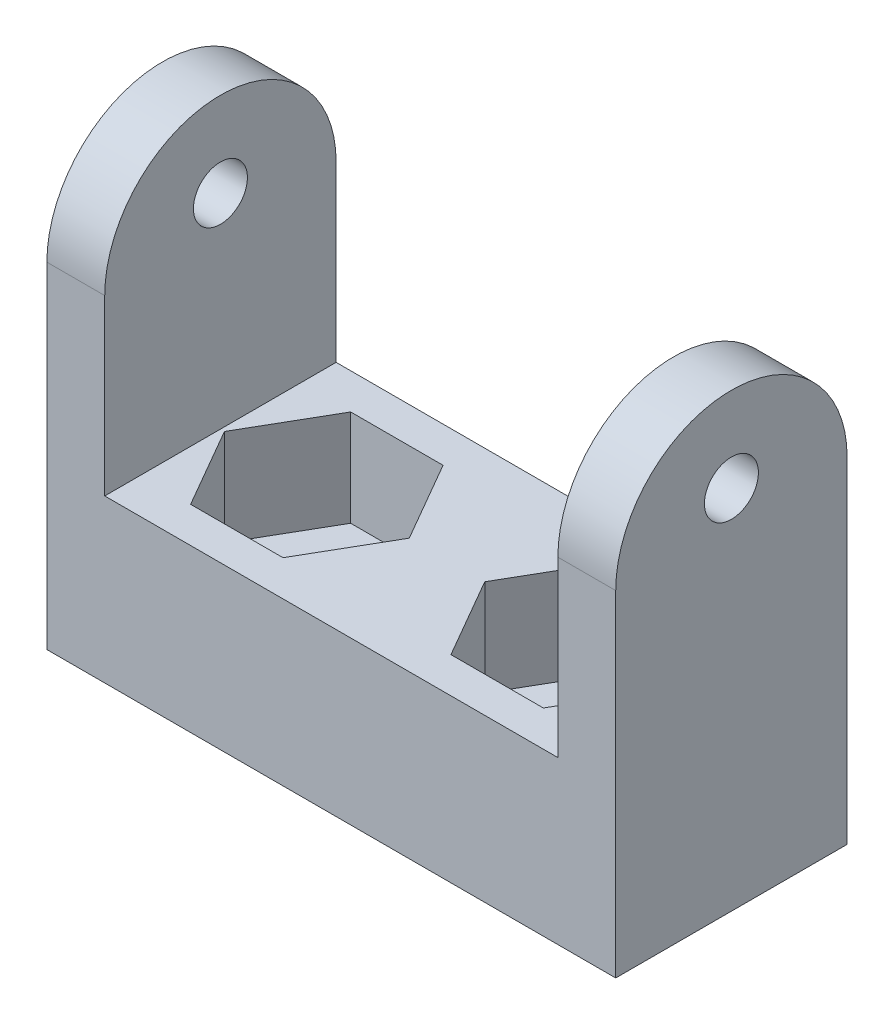
ISO-10303-21;
HEADER;
FILE_DESCRIPTION(('STEP AP214'),'2;1');
FILE_NAME('part.step','',(''),(''),'','','');
FILE_SCHEMA(('AUTOMOTIVE_DESIGN { 1 0 10303 214 1 1 1 1 }'));
ENDSEC;
DATA;
#1=APPLICATION_CONTEXT('core data for automotive mechanical design processes');
#2=APPLICATION_PROTOCOL_DEFINITION('international standard','automotive_design',2000,#1);
#3=PRODUCT_CONTEXT('',#1,'mechanical');
#4=PRODUCT('Part','Part','',(#3));
#5=PRODUCT_RELATED_PRODUCT_CATEGORY('part','',(#4));
#6=PRODUCT_DEFINITION_FORMATION('','',#4);
#7=PRODUCT_DEFINITION_CONTEXT('part definition',#1,'design');
#8=PRODUCT_DEFINITION('design','',#6,#7);
#9=PRODUCT_DEFINITION_SHAPE('','',#8);
#10=(LENGTH_UNIT() NAMED_UNIT(*) SI_UNIT(.MILLI.,.METRE.));
#11=(NAMED_UNIT(*) PLANE_ANGLE_UNIT() SI_UNIT($,.RADIAN.));
#12=(NAMED_UNIT(*) SI_UNIT($,.STERADIAN.) SOLID_ANGLE_UNIT());
#13=UNCERTAINTY_MEASURE_WITH_UNIT(LENGTH_MEASURE(1.E-05),#10,'distance_accuracy_value','');
#14=(GEOMETRIC_REPRESENTATION_CONTEXT(3) GLOBAL_UNCERTAINTY_ASSIGNED_CONTEXT((#13)) GLOBAL_UNIT_ASSIGNED_CONTEXT((#10,
#11,#12)) REPRESENTATION_CONTEXT('',''));
#15=CARTESIAN_POINT('',(0.,0.,0.));
#16=DIRECTION('',(0.,0.,1.));
#17=DIRECTION('',(1.,0.,0.));
#18=AXIS2_PLACEMENT_3D('',#15,#16,#17);
#19=CARTESIAN_POINT('',(0.,8.4,0.));
#20=DIRECTION('',(0.,1.,0.));
#21=DIRECTION('',(0.,0.,1.));
#22=AXIS2_PLACEMENT_3D('',#19,#20,#21);
#23=PLANE('',#22);
#24=DIRECTION('',(-1.,0.,0.));
#25=VECTOR('',#24,1.);
#26=CARTESIAN_POINT('',(-4.35399638286306,8.4,4.15));
#27=LINE('',#26,#25);
#28=CARTESIAN_POINT('',(-4.35399638286306,8.4,4.15));
#29=VERTEX_POINT('',#28);
#30=CARTESIAN_POINT('',(-9.14600361713695,8.4,4.15));
#31=VERTEX_POINT('',#30);
#32=EDGE_CURVE('E212',#29,#31,#27,.T.);
#33=ORIENTED_EDGE('',*,*,#32,.T.);
#34=DIRECTION('',(-0.5,0.,-0.866025403784439));
#35=VECTOR('',#34,1.);
#36=CARTESIAN_POINT('',(-9.14600361713695,8.4,4.15));
#37=LINE('',#36,#35);
#38=CARTESIAN_POINT('',(-11.5420072342739,8.4,0.));
#39=VERTEX_POINT('',#38);
#40=EDGE_CURVE('E63',#31,#39,#37,.T.);
#41=ORIENTED_EDGE('',*,*,#40,.T.);
#42=DIRECTION('',(0.5,0.,-0.866025403784439));
#43=VECTOR('',#42,1.);
#44=CARTESIAN_POINT('',(-11.5420072342739,8.4,0.));
#45=LINE('',#44,#43);
#46=CARTESIAN_POINT('',(-9.14600361713695,8.4,-4.15));
#47=VERTEX_POINT('',#46);
#48=EDGE_CURVE('E224',#39,#47,#45,.T.);
#49=ORIENTED_EDGE('',*,*,#48,.T.);
#50=DIRECTION('',(1.,0.,0.));
#51=VECTOR('',#50,1.);
#52=CARTESIAN_POINT('',(-9.14600361713695,8.4,-4.15));
#53=LINE('',#52,#51);
#54=CARTESIAN_POINT('',(-4.35399638286306,8.4,-4.15));
#55=VERTEX_POINT('',#54);
#56=EDGE_CURVE('E227',#47,#55,#53,.T.);
#57=ORIENTED_EDGE('',*,*,#56,.T.);
#58=DIRECTION('',(0.5,0.,0.866025403784439));
#59=VECTOR('',#58,1.);
#60=CARTESIAN_POINT('',(-4.35399638286306,8.4,-4.15));
#61=LINE('',#60,#59);
#62=CARTESIAN_POINT('',(-1.95799276572611,8.4,0.));
#63=VERTEX_POINT('',#62);
#64=EDGE_CURVE('E230',#55,#63,#61,.T.);
#65=ORIENTED_EDGE('',*,*,#64,.T.);
#66=DIRECTION('',(-0.5,0.,0.866025403784439));
#67=VECTOR('',#66,1.);
#68=CARTESIAN_POINT('',(-1.95799276572611,8.4,0.));
#69=LINE('',#68,#67);
#70=EDGE_CURVE('E233',#63,#29,#69,.T.);
#71=ORIENTED_EDGE('',*,*,#70,.T.);
#72=EDGE_LOOP('',(#33,#41,#49,#57,#65,#71));
#73=FACE_BOUND('',#72,.T.);
#74=DIRECTION('',(0.,0.,1.));
#75=VECTOR('',#74,1.);
#76=CARTESIAN_POINT('',(-11.75,8.4,6.));
#77=LINE('',#76,#75);
#78=CARTESIAN_POINT('',(-11.75,8.4,-6.));
#79=VERTEX_POINT('',#78);
#80=CARTESIAN_POINT('',(-11.75,8.4,6.));
#81=VERTEX_POINT('',#80);
#82=EDGE_CURVE('E265',#79,#81,#77,.T.);
#83=ORIENTED_EDGE('',*,*,#82,.T.);
#84=DIRECTION('',(1.,0.,0.));
#85=VECTOR('',#84,1.);
#86=CARTESIAN_POINT('',(11.75,8.4,6.));
#87=LINE('',#86,#85);
#88=CARTESIAN_POINT('',(11.75,8.4,6.));
#89=VERTEX_POINT('',#88);
#90=EDGE_CURVE('E268',#81,#89,#87,.T.);
#91=ORIENTED_EDGE('',*,*,#90,.T.);
#92=DIRECTION('',(0.,0.,-1.));
#93=VECTOR('',#92,1.);
#94=CARTESIAN_POINT('',(11.75,8.4,6.));
#95=LINE('',#94,#93);
#96=CARTESIAN_POINT('',(11.75,8.4,-6.));
#97=VERTEX_POINT('',#96);
#98=EDGE_CURVE('E271',#89,#97,#95,.T.);
#99=ORIENTED_EDGE('',*,*,#98,.T.);
#100=DIRECTION('',(-1.,0.,0.));
#101=VECTOR('',#100,1.);
#102=CARTESIAN_POINT('',(11.75,8.4,-6.));
#103=LINE('',#102,#101);
#104=EDGE_CURVE('E274',#97,#79,#103,.T.);
#105=ORIENTED_EDGE('',*,*,#104,.T.);
#106=EDGE_LOOP('',(#83,#91,#99,#105));
#107=FACE_BOUND('',#106,.T.);
#108=DIRECTION('',(-1.,0.,0.));
#109=VECTOR('',#108,1.);
#110=CARTESIAN_POINT('',(9.14600361713694,8.4,4.15));
#111=LINE('',#110,#109);
#112=CARTESIAN_POINT('',(9.14600361713694,8.4,4.15));
#113=VERTEX_POINT('',#112);
#114=CARTESIAN_POINT('',(4.35399638286305,8.4,4.15));
#115=VERTEX_POINT('',#114);
#116=EDGE_CURVE('E195',#113,#115,#111,.T.);
#117=ORIENTED_EDGE('',*,*,#116,.T.);
#118=DIRECTION('',(-0.5,0.,-0.866025403784439));
#119=VECTOR('',#118,1.);
#120=CARTESIAN_POINT('',(4.35399638286305,8.4,4.15));
#121=LINE('',#120,#119);
#122=CARTESIAN_POINT('',(1.9579927657261,8.4,0.));
#123=VERTEX_POINT('',#122);
#124=EDGE_CURVE('E55',#115,#123,#121,.T.);
#125=ORIENTED_EDGE('',*,*,#124,.T.);
#126=DIRECTION('',(0.5,0.,-0.866025403784439));
#127=VECTOR('',#126,1.);
#128=CARTESIAN_POINT('',(1.9579927657261,8.4,0.));
#129=LINE('',#128,#127);
#130=CARTESIAN_POINT('',(4.35399638286305,8.4,-4.15));
#131=VERTEX_POINT('',#130);
#132=EDGE_CURVE('E199',#123,#131,#129,.T.);
#133=ORIENTED_EDGE('',*,*,#132,.T.);
#134=DIRECTION('',(1.,0.,0.));
#135=VECTOR('',#134,1.);
#136=CARTESIAN_POINT('',(4.35399638286305,8.4,-4.15));
#137=LINE('',#136,#135);
#138=CARTESIAN_POINT('',(9.14600361713694,8.4,-4.15));
#139=VERTEX_POINT('',#138);
#140=EDGE_CURVE('E655',#131,#139,#137,.T.);
#141=ORIENTED_EDGE('',*,*,#140,.T.);
#142=DIRECTION('',(0.5,0.,0.866025403784439));
#143=VECTOR('',#142,1.);
#144=CARTESIAN_POINT('',(9.14600361713694,8.4,-4.15));
#145=LINE('',#144,#143);
#146=CARTESIAN_POINT('',(11.5420072342739,8.4,0.));
#147=VERTEX_POINT('',#146);
#148=EDGE_CURVE('E652',#139,#147,#145,.T.);
#149=ORIENTED_EDGE('',*,*,#148,.T.);
#150=DIRECTION('',(-0.5,0.,0.866025403784438));
#151=VECTOR('',#150,1.);
#152=CARTESIAN_POINT('',(11.5420072342739,8.4,0.));
#153=LINE('',#152,#151);
#154=EDGE_CURVE('E646',#147,#113,#153,.T.);
#155=ORIENTED_EDGE('',*,*,#154,.T.);
#156=EDGE_LOOP('',(#117,#125,#133,#141,#149,#155));
#157=FACE_BOUND('',#156,.T.);
#158=ADVANCED_FACE('F37',(#73,#107,#157),#23,.T.);
#159=CARTESIAN_POINT('',(0.,0.,0.));
#160=DIRECTION('',(0.,1.,0.));
#161=DIRECTION('',(0.,0.,1.));
#162=AXIS2_PLACEMENT_3D('',#159,#160,#161);
#163=PLANE('',#162);
#164=DIRECTION('',(0.,0.,-1.));
#165=VECTOR('',#164,1.);
#166=CARTESIAN_POINT('',(14.75,0.,-6.));
#167=LINE('',#166,#165);
#168=CARTESIAN_POINT('',(14.75,0.,6.));
#169=VERTEX_POINT('',#168);
#170=CARTESIAN_POINT('',(14.75,0.,-6.));
#171=VERTEX_POINT('',#170);
#172=EDGE_CURVE('E281',#169,#171,#167,.T.);
#173=ORIENTED_EDGE('',*,*,#172,.F.);
#174=DIRECTION('',(1.,0.,0.));
#175=VECTOR('',#174,1.);
#176=CARTESIAN_POINT('',(-14.75,0.,6.));
#177=LINE('',#176,#175);
#178=CARTESIAN_POINT('',(-14.75,0.,6.));
#179=VERTEX_POINT('',#178);
#180=EDGE_CURVE('E298',#179,#169,#177,.T.);
#181=ORIENTED_EDGE('',*,*,#180,.F.);
#182=DIRECTION('',(0.,0.,1.));
#183=VECTOR('',#182,1.);
#184=CARTESIAN_POINT('',(-14.75,0.,-6.));
#185=LINE('',#184,#183);
#186=CARTESIAN_POINT('',(-14.75,0.,-6.));
#187=VERTEX_POINT('',#186);
#188=EDGE_CURVE('E295',#187,#179,#185,.T.);
#189=ORIENTED_EDGE('',*,*,#188,.F.);
#190=DIRECTION('',(-1.,0.,0.));
#191=VECTOR('',#190,1.);
#192=CARTESIAN_POINT('',(-14.75,0.,-6.));
#193=LINE('',#192,#191);
#194=EDGE_CURVE('E292',#171,#187,#193,.T.);
#195=ORIENTED_EDGE('',*,*,#194,.F.);
#196=EDGE_LOOP('',(#173,#181,#189,#195));
#197=FACE_BOUND('',#196,.T.);
#198=CARTESIAN_POINT('',(-6.75,0.,0.));
#199=DIRECTION('',(0.,-1.,0.));
#200=DIRECTION('',(0.,0.,-1.));
#201=AXIS2_PLACEMENT_3D('',#198,#199,#200);
#202=CIRCLE('',#201,2.64999999999999);
#203=CARTESIAN_POINT('',(-6.75,0.,-2.64999999999999));
#204=VERTEX_POINT('',#203);
#205=EDGE_CURVE('E252',#204,#204,#202,.T.);
#206=ORIENTED_EDGE('',*,*,#205,.F.);
#207=EDGE_LOOP('',(#206));
#208=FACE_BOUND('',#207,.T.);
#209=CARTESIAN_POINT('',(6.75,0.,0.));
#210=DIRECTION('',(0.,-1.,0.));
#211=DIRECTION('',(0.,0.,-1.));
#212=AXIS2_PLACEMENT_3D('',#209,#210,#211);
#213=CIRCLE('',#212,2.64999999999999);
#214=CARTESIAN_POINT('',(6.75,0.,-2.64999999999999));
#215=VERTEX_POINT('',#214);
#216=EDGE_CURVE('E249',#215,#215,#213,.T.);
#217=ORIENTED_EDGE('',*,*,#216,.F.);
#218=EDGE_LOOP('',(#217));
#219=FACE_BOUND('',#218,.T.);
#220=ADVANCED_FACE('F352',(#197,#208,#219),#163,.F.);
#221=CARTESIAN_POINT('',(11.75,17.4,0.));
#222=DIRECTION('',(-1.,0.,0.));
#223=DIRECTION('',(0.,0.,1.));
#224=AXIS2_PLACEMENT_3D('',#221,#222,#223);
#225=CYLINDRICAL_SURFACE('',#224,6.);
#226=DIRECTION('',(1.,0.,0.));
#227=VECTOR('',#226,1.);
#228=CARTESIAN_POINT('',(11.75,17.4,-6.));
#229=LINE('',#228,#227);
#230=CARTESIAN_POINT('',(11.75,17.4,-6.));
#231=VERTEX_POINT('',#230);
#232=CARTESIAN_POINT('',(14.75,17.4,-6.));
#233=VERTEX_POINT('',#232);
#234=EDGE_CURVE('E321',#231,#233,#229,.T.);
#235=ORIENTED_EDGE('',*,*,#234,.F.);
#236=CARTESIAN_POINT('',(11.75,17.4,0.));
#237=DIRECTION('',(1.,0.,0.));
#238=DIRECTION('',(0.,0.,-1.));
#239=AXIS2_PLACEMENT_3D('',#236,#237,#238);
#240=CIRCLE('',#239,6.);
#241=CARTESIAN_POINT('',(11.75,17.4,6.));
#242=VERTEX_POINT('',#241);
#243=EDGE_CURVE('E47',#242,#231,#240,.F.);
#244=ORIENTED_EDGE('',*,*,#243,.F.);
#245=DIRECTION('',(1.,0.,0.));
#246=VECTOR('',#245,1.);
#247=CARTESIAN_POINT('',(11.75,17.4,6.));
#248=LINE('',#247,#246);
#249=CARTESIAN_POINT('',(14.75,17.4,6.));
#250=VERTEX_POINT('',#249);
#251=EDGE_CURVE('E324',#250,#242,#248,.F.);
#252=ORIENTED_EDGE('',*,*,#251,.F.);
#253=CARTESIAN_POINT('',(14.75,17.4,0.));
#254=DIRECTION('',(-1.,0.,0.));
#255=DIRECTION('',(0.,0.,1.));
#256=AXIS2_PLACEMENT_3D('',#253,#254,#255);
#257=CIRCLE('',#256,6.);
#258=EDGE_CURVE('E11',#233,#250,#257,.F.);
#259=ORIENTED_EDGE('',*,*,#258,.F.);
#260=EDGE_LOOP('',(#235,#244,#252,#259));
#261=FACE_BOUND('',#260,.T.);
#262=ADVANCED_FACE('F40',(#261),#225,.T.);
#263=CARTESIAN_POINT('',(-14.75,17.4,0.));
#264=DIRECTION('',(-1.,0.,0.));
#265=DIRECTION('',(0.,0.,1.));
#266=AXIS2_PLACEMENT_3D('',#263,#264,#265);
#267=CYLINDRICAL_SURFACE('',#266,6.);
#268=DIRECTION('',(1.,0.,0.));
#269=VECTOR('',#268,1.);
#270=CARTESIAN_POINT('',(-14.75,17.4,-6.));
#271=LINE('',#270,#269);
#272=CARTESIAN_POINT('',(-14.75,17.4,-6.));
#273=VERTEX_POINT('',#272);
#274=CARTESIAN_POINT('',(-11.75,17.4,-6.));
#275=VERTEX_POINT('',#274);
#276=EDGE_CURVE('E309',#273,#275,#271,.T.);
#277=ORIENTED_EDGE('',*,*,#276,.F.);
#278=CARTESIAN_POINT('',(-14.75,17.4,0.));
#279=DIRECTION('',(1.,0.,0.));
#280=DIRECTION('',(0.,0.,-1.));
#281=AXIS2_PLACEMENT_3D('',#278,#279,#280);
#282=CIRCLE('',#281,6.);
#283=CARTESIAN_POINT('',(-14.75,17.4,6.));
#284=VERTEX_POINT('',#283);
#285=EDGE_CURVE('E317',#284,#273,#282,.F.);
#286=ORIENTED_EDGE('',*,*,#285,.F.);
#287=DIRECTION('',(1.,0.,0.));
#288=VECTOR('',#287,1.);
#289=CARTESIAN_POINT('',(-14.75,17.4,6.));
#290=LINE('',#289,#288);
#291=CARTESIAN_POINT('',(-11.75,17.4,6.));
#292=VERTEX_POINT('',#291);
#293=EDGE_CURVE('E314',#292,#284,#290,.F.);
#294=ORIENTED_EDGE('',*,*,#293,.F.);
#295=CARTESIAN_POINT('',(-11.75,17.4,0.));
#296=DIRECTION('',(-1.,0.,0.));
#297=DIRECTION('',(0.,0.,1.));
#298=AXIS2_PLACEMENT_3D('',#295,#296,#297);
#299=CIRCLE('',#298,6.);
#300=EDGE_CURVE('E319',#275,#292,#299,.F.);
#301=ORIENTED_EDGE('',*,*,#300,.F.);
#302=EDGE_LOOP('',(#277,#286,#294,#301));
#303=FACE_BOUND('',#302,.T.);
#304=ADVANCED_FACE('F362',(#303),#267,.T.);
#305=CARTESIAN_POINT('',(14.75,23.4,-6.));
#306=DIRECTION('',(-1.,0.,0.));
#307=DIRECTION('',(0.,0.,1.));
#308=AXIS2_PLACEMENT_3D('',#305,#306,#307);
#309=PLANE('',#308);
#310=CARTESIAN_POINT('',(14.75,19.,0.));
#311=DIRECTION('',(-1.,0.,0.));
#312=DIRECTION('',(0.,0.,1.));
#313=AXIS2_PLACEMENT_3D('',#310,#311,#312);
#314=CIRCLE('',#313,1.4);
#315=CARTESIAN_POINT('',(14.75,19.,1.39999999999999));
#316=VERTEX_POINT('',#315);
#317=EDGE_CURVE('E256',#316,#316,#314,.T.);
#318=ORIENTED_EDGE('',*,*,#317,.T.);
#319=EDGE_LOOP('',(#318));
#320=FACE_BOUND('',#319,.T.);
#321=DIRECTION('',(0.,-1.,0.));
#322=VECTOR('',#321,1.);
#323=CARTESIAN_POINT('',(14.75,23.4,-6.));
#324=LINE('',#323,#322);
#325=EDGE_CURVE('E307',#233,#171,#324,.T.);
#326=ORIENTED_EDGE('',*,*,#325,.F.);
#327=ORIENTED_EDGE('',*,*,#258,.T.);
#328=DIRECTION('',(0.,-1.,0.));
#329=VECTOR('',#328,1.);
#330=CARTESIAN_POINT('',(14.75,23.4,6.));
#331=LINE('',#330,#329);
#332=EDGE_CURVE('E301',#250,#169,#331,.T.);
#333=ORIENTED_EDGE('',*,*,#332,.T.);
#334=ORIENTED_EDGE('',*,*,#172,.T.);
#335=EDGE_LOOP('',(#326,#327,#333,#334));
#336=FACE_BOUND('',#335,.T.);
#337=ADVANCED_FACE('F347',(#320,#336),#309,.F.);
#338=CARTESIAN_POINT('',(-14.75,23.4,-6.));
#339=DIRECTION('',(0.,0.,1.));
#340=DIRECTION('',(1.,0.,0.));
#341=AXIS2_PLACEMENT_3D('',#338,#339,#340);
#342=PLANE('',#341);
#343=DIRECTION('',(0.,1.,0.));
#344=VECTOR('',#343,1.);
#345=CARTESIAN_POINT('',(11.75,8.4,-6.));
#346=LINE('',#345,#344);
#347=EDGE_CURVE('E282',#97,#231,#346,.T.);
#348=ORIENTED_EDGE('',*,*,#347,.T.);
#349=ORIENTED_EDGE('',*,*,#234,.T.);
#350=ORIENTED_EDGE('',*,*,#325,.T.);
#351=ORIENTED_EDGE('',*,*,#194,.T.);
#352=DIRECTION('',(0.,-1.,0.));
#353=VECTOR('',#352,1.);
#354=CARTESIAN_POINT('',(-14.75,23.4,-6.));
#355=LINE('',#354,#353);
#356=EDGE_CURVE('E305',#273,#187,#355,.T.);
#357=ORIENTED_EDGE('',*,*,#356,.F.);
#358=ORIENTED_EDGE('',*,*,#276,.T.);
#359=DIRECTION('',(0.,1.,0.));
#360=VECTOR('',#359,1.);
#361=CARTESIAN_POINT('',(-11.75,8.4,-6.));
#362=LINE('',#361,#360);
#363=EDGE_CURVE('E278',#79,#275,#362,.T.);
#364=ORIENTED_EDGE('',*,*,#363,.F.);
#365=ORIENTED_EDGE('',*,*,#104,.F.);
#366=EDGE_LOOP('',(#348,#349,#350,#351,#357,#358,#364,#365));
#367=FACE_BOUND('',#366,.T.);
#368=ADVANCED_FACE('F336',(#367),#342,.F.);
#369=CARTESIAN_POINT('',(-14.75,23.4,-6.));
#370=DIRECTION('',(1.,0.,0.));
#371=DIRECTION('',(0.,0.,-1.));
#372=AXIS2_PLACEMENT_3D('',#369,#370,#371);
#373=PLANE('',#372);
#374=CARTESIAN_POINT('',(-14.75,19.,0.));
#375=DIRECTION('',(-1.,0.,0.));
#376=DIRECTION('',(0.,0.,1.));
#377=AXIS2_PLACEMENT_3D('',#374,#375,#376);
#378=CIRCLE('',#377,1.4);
#379=CARTESIAN_POINT('',(-14.75,19.,1.4));
#380=VERTEX_POINT('',#379);
#381=EDGE_CURVE('E255',#380,#380,#378,.T.);
#382=ORIENTED_EDGE('',*,*,#381,.F.);
#383=EDGE_LOOP('',(#382));
#384=FACE_BOUND('',#383,.T.);
#385=DIRECTION('',(0.,-1.,0.));
#386=VECTOR('',#385,1.);
#387=CARTESIAN_POINT('',(-14.75,23.4,6.));
#388=LINE('',#387,#386);
#389=EDGE_CURVE('E303',#284,#179,#388,.T.);
#390=ORIENTED_EDGE('',*,*,#389,.F.);
#391=ORIENTED_EDGE('',*,*,#285,.T.);
#392=ORIENTED_EDGE('',*,*,#356,.T.);
#393=ORIENTED_EDGE('',*,*,#188,.T.);
#394=EDGE_LOOP('',(#390,#391,#392,#393));
#395=FACE_BOUND('',#394,.T.);
#396=ADVANCED_FACE('F356',(#384,#395),#373,.F.);
#397=CARTESIAN_POINT('',(-14.75,23.4,6.));
#398=DIRECTION('',(0.,0.,-1.));
#399=DIRECTION('',(-1.,0.,0.));
#400=AXIS2_PLACEMENT_3D('',#397,#398,#399);
#401=PLANE('',#400);
#402=ORIENTED_EDGE('',*,*,#332,.F.);
#403=ORIENTED_EDGE('',*,*,#251,.T.);
#404=DIRECTION('',(0.,1.,0.));
#405=VECTOR('',#404,1.);
#406=CARTESIAN_POINT('',(11.75,8.4,6.));
#407=LINE('',#406,#405);
#408=EDGE_CURVE('E285',#89,#242,#407,.T.);
#409=ORIENTED_EDGE('',*,*,#408,.F.);
#410=ORIENTED_EDGE('',*,*,#90,.F.);
#411=DIRECTION('',(0.,1.,0.));
#412=VECTOR('',#411,1.);
#413=CARTESIAN_POINT('',(-11.75,8.4,6.));
#414=LINE('',#413,#412);
#415=EDGE_CURVE('E277',#81,#292,#414,.T.);
#416=ORIENTED_EDGE('',*,*,#415,.T.);
#417=ORIENTED_EDGE('',*,*,#293,.T.);
#418=ORIENTED_EDGE('',*,*,#389,.T.);
#419=ORIENTED_EDGE('',*,*,#180,.T.);
#420=EDGE_LOOP('',(#402,#403,#409,#410,#416,#417,#418,#419));
#421=FACE_BOUND('',#420,.T.);
#422=ADVANCED_FACE('F343',(#421),#401,.F.);
#423=CARTESIAN_POINT('',(-11.75,8.4,6.));
#424=DIRECTION('',(-1.,0.,0.));
#425=DIRECTION('',(0.,0.,1.));
#426=AXIS2_PLACEMENT_3D('',#423,#424,#425);
#427=PLANE('',#426);
#428=CARTESIAN_POINT('',(-11.75,19.,0.));
#429=DIRECTION('',(-1.,0.,0.));
#430=DIRECTION('',(0.,0.,1.));
#431=AXIS2_PLACEMENT_3D('',#428,#429,#430);
#432=CIRCLE('',#431,1.4);
#433=CARTESIAN_POINT('',(-11.75,19.,1.4));
#434=VERTEX_POINT('',#433);
#435=EDGE_CURVE('E262',#434,#434,#432,.T.);
#436=ORIENTED_EDGE('',*,*,#435,.T.);
#437=EDGE_LOOP('',(#436));
#438=FACE_BOUND('',#437,.T.);
#439=ORIENTED_EDGE('',*,*,#363,.T.);
#440=ORIENTED_EDGE('',*,*,#300,.T.);
#441=ORIENTED_EDGE('',*,*,#415,.F.);
#442=ORIENTED_EDGE('',*,*,#82,.F.);
#443=EDGE_LOOP('',(#439,#440,#441,#442));
#444=FACE_BOUND('',#443,.T.);
#445=ADVANCED_FACE('F360',(#438,#444),#427,.F.);
#446=CARTESIAN_POINT('',(11.75,8.4,6.));
#447=DIRECTION('',(1.,0.,0.));
#448=DIRECTION('',(0.,0.,-1.));
#449=AXIS2_PLACEMENT_3D('',#446,#447,#448);
#450=PLANE('',#449);
#451=CARTESIAN_POINT('',(11.75,19.,0.));
#452=DIRECTION('',(1.,0.,0.));
#453=DIRECTION('',(0.,0.,-1.));
#454=AXIS2_PLACEMENT_3D('',#451,#452,#453);
#455=CIRCLE('',#454,1.4);
#456=CARTESIAN_POINT('',(11.75,19.,1.39999999999999));
#457=VERTEX_POINT('',#456);
#458=EDGE_CURVE('E259',#457,#457,#455,.T.);
#459=ORIENTED_EDGE('',*,*,#458,.T.);
#460=EDGE_LOOP('',(#459));
#461=FACE_BOUND('',#460,.T.);
#462=ORIENTED_EDGE('',*,*,#408,.T.);
#463=ORIENTED_EDGE('',*,*,#243,.T.);
#464=ORIENTED_EDGE('',*,*,#347,.F.);
#465=ORIENTED_EDGE('',*,*,#98,.F.);
#466=EDGE_LOOP('',(#462,#463,#464,#465));
#467=FACE_BOUND('',#466,.T.);
#468=ADVANCED_FACE('F329',(#461,#467),#450,.F.);
#469=CARTESIAN_POINT('',(14.75,19.,0.));
#470=DIRECTION('',(-1.,0.,0.));
#471=DIRECTION('',(0.,0.,1.));
#472=AXIS2_PLACEMENT_3D('',#469,#470,#471);
#473=CYLINDRICAL_SURFACE('',#472,1.4);
#474=CARTESIAN_POINT('',(14.75,19.,1.39999999999999));
#475=CARTESIAN_POINT('',(14.71875,19.,1.39999999999999));
#476=CARTESIAN_POINT('',(14.6875,19.,1.39999999999999));
#477=CARTESIAN_POINT('',(14.625,19.,1.39999999999999));
#478=CARTESIAN_POINT('',(14.59375,19.,1.39999999999999));
#479=CARTESIAN_POINT('',(14.53125,19.,1.39999999999999));
#480=CARTESIAN_POINT('',(14.5,19.,1.39999999999999));
#481=CARTESIAN_POINT('',(14.4375,19.,1.39999999999999));
#482=CARTESIAN_POINT('',(14.40625,19.,1.39999999999999));
#483=CARTESIAN_POINT('',(14.34375,19.,1.39999999999999));
#484=CARTESIAN_POINT('',(14.3125,19.,1.39999999999999));
#485=CARTESIAN_POINT('',(14.25,19.,1.39999999999999));
#486=CARTESIAN_POINT('',(14.21875,19.,1.39999999999999));
#487=CARTESIAN_POINT('',(14.15625,19.,1.39999999999999));
#488=CARTESIAN_POINT('',(14.125,19.,1.39999999999999));
#489=CARTESIAN_POINT('',(14.0625,19.,1.39999999999999));
#490=CARTESIAN_POINT('',(14.03125,19.,1.39999999999999));
#491=CARTESIAN_POINT('',(13.96875,19.,1.39999999999999));
#492=CARTESIAN_POINT('',(13.9375,19.,1.39999999999999));
#493=CARTESIAN_POINT('',(13.875,19.,1.39999999999999));
#494=CARTESIAN_POINT('',(13.84375,19.,1.39999999999999));
#495=CARTESIAN_POINT('',(13.78125,19.,1.39999999999999));
#496=CARTESIAN_POINT('',(13.75,19.,1.39999999999999));
#497=CARTESIAN_POINT('',(13.6875,19.,1.39999999999999));
#498=CARTESIAN_POINT('',(13.65625,19.,1.39999999999999));
#499=CARTESIAN_POINT('',(13.59375,19.,1.39999999999999));
#500=CARTESIAN_POINT('',(13.5625,19.,1.39999999999999));
#501=CARTESIAN_POINT('',(13.5,19.,1.39999999999999));
#502=CARTESIAN_POINT('',(13.46875,19.,1.39999999999999));
#503=CARTESIAN_POINT('',(13.40625,19.,1.39999999999999));
#504=CARTESIAN_POINT('',(13.375,19.,1.39999999999999));
#505=CARTESIAN_POINT('',(13.3125,19.,1.39999999999999));
#506=CARTESIAN_POINT('',(13.28125,19.,1.39999999999999));
#507=CARTESIAN_POINT('',(13.21875,19.,1.39999999999999));
#508=CARTESIAN_POINT('',(13.1875,19.,1.39999999999999));
#509=CARTESIAN_POINT('',(13.125,19.,1.39999999999999));
#510=CARTESIAN_POINT('',(13.09375,19.,1.39999999999999));
#511=CARTESIAN_POINT('',(13.03125,19.,1.39999999999999));
#512=CARTESIAN_POINT('',(13.,19.,1.39999999999999));
#513=CARTESIAN_POINT('',(12.9375,19.,1.39999999999999));
#514=CARTESIAN_POINT('',(12.90625,19.,1.39999999999999));
#515=CARTESIAN_POINT('',(12.84375,19.,1.39999999999999));
#516=CARTESIAN_POINT('',(12.8125,19.,1.39999999999999));
#517=CARTESIAN_POINT('',(12.75,19.,1.39999999999999));
#518=CARTESIAN_POINT('',(12.71875,19.,1.39999999999999));
#519=CARTESIAN_POINT('',(12.65625,19.,1.39999999999999));
#520=CARTESIAN_POINT('',(12.625,19.,1.39999999999999));
#521=CARTESIAN_POINT('',(12.5625,19.,1.39999999999999));
#522=CARTESIAN_POINT('',(12.53125,19.,1.39999999999999));
#523=CARTESIAN_POINT('',(12.46875,19.,1.39999999999999));
#524=CARTESIAN_POINT('',(12.4375,19.,1.39999999999999));
#525=CARTESIAN_POINT('',(12.375,19.,1.39999999999999));
#526=CARTESIAN_POINT('',(12.34375,19.,1.39999999999999));
#527=CARTESIAN_POINT('',(12.28125,19.,1.39999999999999));
#528=CARTESIAN_POINT('',(12.25,19.,1.39999999999999));
#529=CARTESIAN_POINT('',(12.1875,19.,1.39999999999999));
#530=CARTESIAN_POINT('',(12.15625,19.,1.39999999999999));
#531=CARTESIAN_POINT('',(12.09375,19.,1.39999999999999));
#532=CARTESIAN_POINT('',(12.0625,19.,1.39999999999999));
#533=CARTESIAN_POINT('',(12.,19.,1.39999999999999));
#534=CARTESIAN_POINT('',(11.96875,19.,1.39999999999999));
#535=CARTESIAN_POINT('',(11.90625,19.,1.39999999999999));
#536=CARTESIAN_POINT('',(11.875,19.,1.39999999999999));
#537=CARTESIAN_POINT('',(11.8125,19.,1.39999999999999));
#538=CARTESIAN_POINT('',(11.78125,19.,1.39999999999999));
#539=CARTESIAN_POINT('',(11.75,19.,1.39999999999999));
#540=B_SPLINE_CURVE_WITH_KNOTS('',3,(#474,#475,#476,#477,#478,#479,#480,#481,#482,#483,#484,
#485,#486,#487,#488,#489,#490,#491,#492,#493,#494,#495,#496,#497,#498,#499,#500,#501,#502,#503,
#504,#505,#506,#507,#508,#509,#510,#511,#512,#513,#514,#515,#516,#517,#518,#519,#520,#521,#522,
#523,#524,#525,#526,#527,#528,#529,#530,#531,#532,#533,#534,#535,#536,#537,#538,#539),
.UNSPECIFIED.,.F.,.F.,(4,2,2,2,2,2,2,2,2,2,2,2,2,2,2,2,2,2,2,2,2,2,2,2,2,2,2,2,2,2,2,2,4),(0.,
0.0937500000000001,0.1875,0.28125,0.375,0.46875,0.5625,0.656250000000001,0.750000000000001,
0.843750000000001,0.937500000000001,1.03125,1.125,1.21875,1.3125,1.40625,1.5,1.59375,1.6875,
1.78125,1.875,1.96875,2.0625,2.15625,2.25,2.34375,2.4375,2.53125,2.625,2.71875,2.8125,2.90625,
3.),.UNSPECIFIED.);
#541=EDGE_CURVE('BSEAM384',#316,#457,#540,.T.);
#542=ORIENTED_EDGE('',*,*,#317,.F.);
#543=ORIENTED_EDGE('',*,*,#458,.F.);
#544=ORIENTED_EDGE('',*,*,#541,.T.);
#545=ORIENTED_EDGE('',*,*,#541,.F.);
#546=EDGE_LOOP('',(#542,#544,#543,#545));
#547=FACE_BOUND('',#546,.T.);
#548=ADVANCED_FACE('F384',(#547),#473,.F.);
#549=CARTESIAN_POINT('',(-14.75,19.,1.4));
#550=CARTESIAN_POINT('',(-14.71875,19.,1.4));
#551=CARTESIAN_POINT('',(-14.6875,19.,1.4));
#552=CARTESIAN_POINT('',(-14.625,19.,1.4));
#553=CARTESIAN_POINT('',(-14.59375,19.,1.4));
#554=CARTESIAN_POINT('',(-14.53125,19.,1.4));
#555=CARTESIAN_POINT('',(-14.5,19.,1.4));
#556=CARTESIAN_POINT('',(-14.4375,19.,1.4));
#557=CARTESIAN_POINT('',(-14.40625,19.,1.4));
#558=CARTESIAN_POINT('',(-14.34375,19.,1.4));
#559=CARTESIAN_POINT('',(-14.3125,19.,1.4));
#560=CARTESIAN_POINT('',(-14.25,19.,1.4));
#561=CARTESIAN_POINT('',(-14.21875,19.,1.4));
#562=CARTESIAN_POINT('',(-14.15625,19.,1.4));
#563=CARTESIAN_POINT('',(-14.125,19.,1.4));
#564=CARTESIAN_POINT('',(-14.0625,19.,1.4));
#565=CARTESIAN_POINT('',(-14.03125,19.,1.4));
#566=CARTESIAN_POINT('',(-13.96875,19.,1.4));
#567=CARTESIAN_POINT('',(-13.9375,19.,1.4));
#568=CARTESIAN_POINT('',(-13.875,19.,1.4));
#569=CARTESIAN_POINT('',(-13.84375,19.,1.4));
#570=CARTESIAN_POINT('',(-13.78125,19.,1.4));
#571=CARTESIAN_POINT('',(-13.75,19.,1.4));
#572=CARTESIAN_POINT('',(-13.6875,19.,1.4));
#573=CARTESIAN_POINT('',(-13.65625,19.,1.4));
#574=CARTESIAN_POINT('',(-13.59375,19.,1.4));
#575=CARTESIAN_POINT('',(-13.5625,19.,1.4));
#576=CARTESIAN_POINT('',(-13.5,19.,1.4));
#577=CARTESIAN_POINT('',(-13.46875,19.,1.4));
#578=CARTESIAN_POINT('',(-13.40625,19.,1.4));
#579=CARTESIAN_POINT('',(-13.375,19.,1.4));
#580=CARTESIAN_POINT('',(-13.3125,19.,1.4));
#581=CARTESIAN_POINT('',(-13.28125,19.,1.4));
#582=CARTESIAN_POINT('',(-13.21875,19.,1.4));
#583=CARTESIAN_POINT('',(-13.1875,19.,1.4));
#584=CARTESIAN_POINT('',(-13.125,19.,1.4));
#585=CARTESIAN_POINT('',(-13.09375,19.,1.4));
#586=CARTESIAN_POINT('',(-13.03125,19.,1.4));
#587=CARTESIAN_POINT('',(-13.,19.,1.4));
#588=CARTESIAN_POINT('',(-12.9375,19.,1.4));
#589=CARTESIAN_POINT('',(-12.90625,19.,1.4));
#590=CARTESIAN_POINT('',(-12.84375,19.,1.4));
#591=CARTESIAN_POINT('',(-12.8125,19.,1.4));
#592=CARTESIAN_POINT('',(-12.75,19.,1.4));
#593=CARTESIAN_POINT('',(-12.71875,19.,1.4));
#594=CARTESIAN_POINT('',(-12.65625,19.,1.4));
#595=CARTESIAN_POINT('',(-12.625,19.,1.4));
#596=CARTESIAN_POINT('',(-12.5625,19.,1.4));
#597=CARTESIAN_POINT('',(-12.53125,19.,1.4));
#598=CARTESIAN_POINT('',(-12.46875,19.,1.4));
#599=CARTESIAN_POINT('',(-12.4375,19.,1.4));
#600=CARTESIAN_POINT('',(-12.375,19.,1.4));
#601=CARTESIAN_POINT('',(-12.34375,19.,1.4));
#602=CARTESIAN_POINT('',(-12.28125,19.,1.4));
#603=CARTESIAN_POINT('',(-12.25,19.,1.4));
#604=CARTESIAN_POINT('',(-12.1875,19.,1.4));
#605=CARTESIAN_POINT('',(-12.15625,19.,1.4));
#606=CARTESIAN_POINT('',(-12.09375,19.,1.4));
#607=CARTESIAN_POINT('',(-12.0625,19.,1.4));
#608=CARTESIAN_POINT('',(-12.,19.,1.4));
#609=CARTESIAN_POINT('',(-11.96875,19.,1.4));
#610=CARTESIAN_POINT('',(-11.90625,19.,1.4));
#611=CARTESIAN_POINT('',(-11.875,19.,1.4));
#612=CARTESIAN_POINT('',(-11.8125,19.,1.4));
#613=CARTESIAN_POINT('',(-11.78125,19.,1.4));
#614=CARTESIAN_POINT('',(-11.75,19.,1.4));
#615=B_SPLINE_CURVE_WITH_KNOTS('',3,(#549,#550,#551,#552,#553,#554,#555,#556,#557,#558,#559,
#560,#561,#562,#563,#564,#565,#566,#567,#568,#569,#570,#571,#572,#573,#574,#575,#576,#577,#578,
#579,#580,#581,#582,#583,#584,#585,#586,#587,#588,#589,#590,#591,#592,#593,#594,#595,#596,#597,
#598,#599,#600,#601,#602,#603,#604,#605,#606,#607,#608,#609,#610,#611,#612,#613,#614),
.UNSPECIFIED.,.F.,.F.,(4,2,2,2,2,2,2,2,2,2,2,2,2,2,2,2,2,2,2,2,2,2,2,2,2,2,2,2,2,2,2,2,4),(0.,
0.0937500000000001,0.1875,0.28125,0.375,0.46875,0.5625,0.656250000000001,0.750000000000001,
0.843750000000001,0.937500000000001,1.03125,1.125,1.21875,1.3125,1.40625,1.5,1.59375,1.6875,
1.78125,1.875,1.96875,2.0625,2.15625,2.25,2.34375,2.4375,2.53125,2.625,2.71875,2.8125,2.90625,
3.),.UNSPECIFIED.);
#616=EDGE_CURVE('BSEAM380',#380,#434,#615,.T.);
#617=ORIENTED_EDGE('',*,*,#381,.T.);
#618=ORIENTED_EDGE('',*,*,#435,.F.);
#619=ORIENTED_EDGE('',*,*,#616,.T.);
#620=ORIENTED_EDGE('',*,*,#616,.F.);
#621=EDGE_LOOP('',(#617,#619,#618,#620));
#622=FACE_BOUND('',#621,.T.);
#623=ADVANCED_FACE('F380',(#622),#473,.F.);
#624=CARTESIAN_POINT('',(-6.75,0.,0.));
#625=DIRECTION('',(0.,-1.,0.));
#626=DIRECTION('',(0.,0.,-1.));
#627=AXIS2_PLACEMENT_3D('',#624,#625,#626);
#628=CYLINDRICAL_SURFACE('',#627,2.64999999999999);
#629=CARTESIAN_POINT('',(-6.75,3.4,0.));
#630=DIRECTION('',(0.,-1.,0.));
#631=DIRECTION('',(0.,0.,-1.));
#632=AXIS2_PLACEMENT_3D('',#629,#630,#631);
#633=CIRCLE('',#632,2.64999999999999);
#634=CARTESIAN_POINT('',(-6.75,3.4,-2.64999999999999));
#635=VERTEX_POINT('',#634);
#636=EDGE_CURVE('E42',#635,#635,#633,.F.);
#637=ORIENTED_EDGE('',*,*,#636,.T.);
#638=EDGE_LOOP('',(#637));
#639=FACE_BOUND('',#638,.T.);
#640=ORIENTED_EDGE('',*,*,#205,.T.);
#641=EDGE_LOOP('',(#640));
#642=FACE_BOUND('',#641,.T.);
#643=ADVANCED_FACE('F429',(#639,#642),#628,.F.);
#644=CARTESIAN_POINT('',(6.75,0.,0.));
#645=DIRECTION('',(0.,-1.,0.));
#646=DIRECTION('',(0.,0.,-1.));
#647=AXIS2_PLACEMENT_3D('',#644,#645,#646);
#648=CYLINDRICAL_SURFACE('',#647,2.64999999999999);
#649=CARTESIAN_POINT('',(6.75,3.4,0.));
#650=DIRECTION('',(0.,-1.,0.));
#651=DIRECTION('',(0.,0.,-1.));
#652=AXIS2_PLACEMENT_3D('',#649,#650,#651);
#653=CIRCLE('',#652,2.64999999999999);
#654=CARTESIAN_POINT('',(6.75,3.4,-2.64999999999999));
#655=VERTEX_POINT('',#654);
#656=EDGE_CURVE('E200',#655,#655,#653,.F.);
#657=ORIENTED_EDGE('',*,*,#656,.T.);
#658=EDGE_LOOP('',(#657));
#659=FACE_BOUND('',#658,.T.);
#660=ORIENTED_EDGE('',*,*,#216,.T.);
#661=EDGE_LOOP('',(#660));
#662=FACE_BOUND('',#661,.T.);
#663=ADVANCED_FACE('F436',(#659,#662),#648,.F.);
#664=CARTESIAN_POINT('',(0.,3.4,0.));
#665=DIRECTION('',(0.,-1.,0.));
#666=DIRECTION('',(0.,0.,-1.));
#667=AXIS2_PLACEMENT_3D('',#664,#665,#666);
#668=PLANE('',#667);
#669=DIRECTION('',(-0.5,0.,-0.866025403784439));
#670=VECTOR('',#669,1.);
#671=CARTESIAN_POINT('',(4.35399638286305,3.4,4.15));
#672=LINE('',#671,#670);
#673=CARTESIAN_POINT('',(4.35399638286305,3.4,4.15));
#674=VERTEX_POINT('',#673);
#675=CARTESIAN_POINT('',(1.9579927657261,3.4,0.));
#676=VERTEX_POINT('',#675);
#677=EDGE_CURVE('E185',#674,#676,#672,.T.);
#678=ORIENTED_EDGE('',*,*,#677,.F.);
#679=DIRECTION('',(-1.,0.,0.));
#680=VECTOR('',#679,1.);
#681=CARTESIAN_POINT('',(9.14600361713694,3.4,4.15));
#682=LINE('',#681,#680);
#683=CARTESIAN_POINT('',(9.14600361713694,3.4,4.15));
#684=VERTEX_POINT('',#683);
#685=EDGE_CURVE('E660',#684,#674,#682,.T.);
#686=ORIENTED_EDGE('',*,*,#685,.F.);
#687=DIRECTION('',(-0.5,0.,0.866025403784438));
#688=VECTOR('',#687,1.);
#689=CARTESIAN_POINT('',(11.5420072342739,3.4,0.));
#690=LINE('',#689,#688);
#691=CARTESIAN_POINT('',(11.5420072342739,3.4,0.));
#692=VERTEX_POINT('',#691);
#693=EDGE_CURVE('E669',#692,#684,#690,.T.);
#694=ORIENTED_EDGE('',*,*,#693,.F.);
#695=DIRECTION('',(0.5,0.,0.866025403784439));
#696=VECTOR('',#695,1.);
#697=CARTESIAN_POINT('',(9.14600361713694,3.4,-4.15));
#698=LINE('',#697,#696);
#699=CARTESIAN_POINT('',(9.14600361713694,3.4,-4.15));
#700=VERTEX_POINT('',#699);
#701=EDGE_CURVE('E671',#700,#692,#698,.T.);
#702=ORIENTED_EDGE('',*,*,#701,.F.);
#703=DIRECTION('',(1.,0.,0.));
#704=VECTOR('',#703,1.);
#705=CARTESIAN_POINT('',(4.35399638286305,3.4,-4.15));
#706=LINE('',#705,#704);
#707=CARTESIAN_POINT('',(4.35399638286305,3.4,-4.15));
#708=VERTEX_POINT('',#707);
#709=EDGE_CURVE('E187',#708,#700,#706,.T.);
#710=ORIENTED_EDGE('',*,*,#709,.F.);
#711=DIRECTION('',(0.5,0.,-0.866025403784439));
#712=VECTOR('',#711,1.);
#713=CARTESIAN_POINT('',(1.9579927657261,3.4,0.));
#714=LINE('',#713,#712);
#715=EDGE_CURVE('E180',#676,#708,#714,.T.);
#716=ORIENTED_EDGE('',*,*,#715,.F.);
#717=EDGE_LOOP('',(#678,#686,#694,#702,#710,#716));
#718=FACE_BOUND('',#717,.T.);
#719=ORIENTED_EDGE('',*,*,#656,.F.);
#720=EDGE_LOOP('',(#719));
#721=FACE_BOUND('',#720,.T.);
#722=ADVANCED_FACE('F182',(#718,#721),#668,.F.);
#723=CARTESIAN_POINT('',(4.35399638286305,3.4,4.15));
#724=DIRECTION('',(0.866025403784439,0.,-0.5));
#725=DIRECTION('',(-0.5,0.,-0.866025403784439));
#726=AXIS2_PLACEMENT_3D('',#723,#724,#725);
#727=PLANE('',#726);
#728=ORIENTED_EDGE('',*,*,#124,.F.);
#729=DIRECTION('',(0.,1.,0.));
#730=VECTOR('',#729,1.);
#731=CARTESIAN_POINT('',(4.35399638286305,3.4,4.15));
#732=LINE('',#731,#730);
#733=EDGE_CURVE('E194',#674,#115,#732,.T.);
#734=ORIENTED_EDGE('',*,*,#733,.F.);
#735=ORIENTED_EDGE('',*,*,#677,.T.);
#736=DIRECTION('',(0.,1.,0.));
#737=VECTOR('',#736,1.);
#738=CARTESIAN_POINT('',(1.9579927657261,3.4,0.));
#739=LINE('',#738,#737);
#740=EDGE_CURVE('E193',#676,#123,#739,.T.);
#741=ORIENTED_EDGE('',*,*,#740,.T.);
#742=EDGE_LOOP('',(#728,#734,#735,#741));
#743=FACE_BOUND('',#742,.T.);
#744=ADVANCED_FACE('F192',(#743),#727,.T.);
#745=CARTESIAN_POINT('',(1.9579927657261,3.4,0.));
#746=DIRECTION('',(0.866025403784439,0.,0.5));
#747=DIRECTION('',(0.5,0.,-0.866025403784439));
#748=AXIS2_PLACEMENT_3D('',#745,#746,#747);
#749=PLANE('',#748);
#750=ORIENTED_EDGE('',*,*,#132,.F.);
#751=ORIENTED_EDGE('',*,*,#740,.F.);
#752=ORIENTED_EDGE('',*,*,#715,.T.);
#753=DIRECTION('',(0.,1.,0.));
#754=VECTOR('',#753,1.);
#755=CARTESIAN_POINT('',(4.35399638286305,3.4,-4.15));
#756=LINE('',#755,#754);
#757=EDGE_CURVE('E201',#708,#131,#756,.T.);
#758=ORIENTED_EDGE('',*,*,#757,.T.);
#759=EDGE_LOOP('',(#750,#751,#752,#758));
#760=FACE_BOUND('',#759,.T.);
#761=ADVANCED_FACE('F197',(#760),#749,.T.);
#762=CARTESIAN_POINT('',(4.35399638286305,3.4,-4.15));
#763=DIRECTION('',(0.,0.,1.));
#764=DIRECTION('',(1.,0.,0.));
#765=AXIS2_PLACEMENT_3D('',#762,#763,#764);
#766=PLANE('',#765);
#767=ORIENTED_EDGE('',*,*,#140,.F.);
#768=ORIENTED_EDGE('',*,*,#757,.F.);
#769=ORIENTED_EDGE('',*,*,#709,.T.);
#770=DIRECTION('',(0.,1.,0.));
#771=VECTOR('',#770,1.);
#772=CARTESIAN_POINT('',(9.14600361713694,3.4,-4.15));
#773=LINE('',#772,#771);
#774=EDGE_CURVE('E204',#700,#139,#773,.T.);
#775=ORIENTED_EDGE('',*,*,#774,.T.);
#776=EDGE_LOOP('',(#767,#768,#769,#775));
#777=FACE_BOUND('',#776,.T.);
#778=ADVANCED_FACE('F462',(#777),#766,.T.);
#779=CARTESIAN_POINT('',(9.14600361713694,3.4,-4.15));
#780=DIRECTION('',(-0.866025403784439,0.,0.5));
#781=DIRECTION('',(0.5,0.,0.866025403784439));
#782=AXIS2_PLACEMENT_3D('',#779,#780,#781);
#783=PLANE('',#782);
#784=ORIENTED_EDGE('',*,*,#148,.F.);
#785=ORIENTED_EDGE('',*,*,#774,.F.);
#786=ORIENTED_EDGE('',*,*,#701,.T.);
#787=DIRECTION('',(0.,1.,0.));
#788=VECTOR('',#787,1.);
#789=CARTESIAN_POINT('',(11.5420072342739,3.4,0.));
#790=LINE('',#789,#788);
#791=EDGE_CURVE('E662',#692,#147,#790,.T.);
#792=ORIENTED_EDGE('',*,*,#791,.T.);
#793=EDGE_LOOP('',(#784,#785,#786,#792));
#794=FACE_BOUND('',#793,.T.);
#795=ADVANCED_FACE('F469',(#794),#783,.T.);
#796=CARTESIAN_POINT('',(11.5420072342739,3.4,0.));
#797=DIRECTION('',(-0.866025403784439,0.,-0.5));
#798=DIRECTION('',(-0.5,0.,0.866025403784439));
#799=AXIS2_PLACEMENT_3D('',#796,#797,#798);
#800=PLANE('',#799);
#801=ORIENTED_EDGE('',*,*,#154,.F.);
#802=ORIENTED_EDGE('',*,*,#791,.F.);
#803=ORIENTED_EDGE('',*,*,#693,.T.);
#804=DIRECTION('',(0.,1.,0.));
#805=VECTOR('',#804,1.);
#806=CARTESIAN_POINT('',(9.14600361713694,3.4,4.15));
#807=LINE('',#806,#805);
#808=EDGE_CURVE('E645',#684,#113,#807,.T.);
#809=ORIENTED_EDGE('',*,*,#808,.T.);
#810=EDGE_LOOP('',(#801,#802,#803,#809));
#811=FACE_BOUND('',#810,.T.);
#812=ADVANCED_FACE('F477',(#811),#800,.T.);
#813=CARTESIAN_POINT('',(9.14600361713694,3.4,4.15));
#814=DIRECTION('',(0.,0.,-1.));
#815=DIRECTION('',(-1.,0.,0.));
#816=AXIS2_PLACEMENT_3D('',#813,#814,#815);
#817=PLANE('',#816);
#818=ORIENTED_EDGE('',*,*,#116,.F.);
#819=ORIENTED_EDGE('',*,*,#808,.F.);
#820=ORIENTED_EDGE('',*,*,#685,.T.);
#821=ORIENTED_EDGE('',*,*,#733,.T.);
#822=EDGE_LOOP('',(#818,#819,#820,#821));
#823=FACE_BOUND('',#822,.T.);
#824=ADVANCED_FACE('F485',(#823),#817,.T.);
#825=CARTESIAN_POINT('',(0.,3.4,0.));
#826=DIRECTION('',(0.,-1.,0.));
#827=DIRECTION('',(0.,0.,-1.));
#828=AXIS2_PLACEMENT_3D('',#825,#826,#827);
#829=PLANE('',#828);
#830=DIRECTION('',(-0.5,0.,-0.866025403784439));
#831=VECTOR('',#830,1.);
#832=CARTESIAN_POINT('',(-9.14600361713695,3.4,4.15));
#833=LINE('',#832,#831);
#834=CARTESIAN_POINT('',(-9.14600361713695,3.4,4.15));
#835=VERTEX_POINT('',#834);
#836=CARTESIAN_POINT('',(-11.5420072342739,3.4,0.));
#837=VERTEX_POINT('',#836);
#838=EDGE_CURVE('E208',#835,#837,#833,.T.);
#839=ORIENTED_EDGE('',*,*,#838,.F.);
#840=DIRECTION('',(-1.,0.,0.));
#841=VECTOR('',#840,1.);
#842=CARTESIAN_POINT('',(-4.35399638286306,3.4,4.15));
#843=LINE('',#842,#841);
#844=CARTESIAN_POINT('',(-4.35399638286306,3.4,4.15));
#845=VERTEX_POINT('',#844);
#846=EDGE_CURVE('E220',#845,#835,#843,.T.);
#847=ORIENTED_EDGE('',*,*,#846,.F.);
#848=DIRECTION('',(-0.5,0.,0.866025403784439));
#849=VECTOR('',#848,1.);
#850=CARTESIAN_POINT('',(-1.95799276572611,3.4,0.));
#851=LINE('',#850,#849);
#852=CARTESIAN_POINT('',(-1.95799276572611,3.4,0.));
#853=VERTEX_POINT('',#852);
#854=EDGE_CURVE('E218',#853,#845,#851,.T.);
#855=ORIENTED_EDGE('',*,*,#854,.F.);
#856=DIRECTION('',(0.5,0.,0.866025403784439));
#857=VECTOR('',#856,1.);
#858=CARTESIAN_POINT('',(-4.35399638286306,3.4,-4.15));
#859=LINE('',#858,#857);
#860=CARTESIAN_POINT('',(-4.35399638286306,3.4,-4.15));
#861=VERTEX_POINT('',#860);
#862=EDGE_CURVE('E216',#861,#853,#859,.T.);
#863=ORIENTED_EDGE('',*,*,#862,.F.);
#864=DIRECTION('',(1.,0.,0.));
#865=VECTOR('',#864,1.);
#866=CARTESIAN_POINT('',(-9.14600361713695,3.4,-4.15));
#867=LINE('',#866,#865);
#868=CARTESIAN_POINT('',(-9.14600361713695,3.4,-4.15));
#869=VERTEX_POINT('',#868);
#870=EDGE_CURVE('E214',#869,#861,#867,.T.);
#871=ORIENTED_EDGE('',*,*,#870,.F.);
#872=DIRECTION('',(0.5,0.,-0.866025403784439));
#873=VECTOR('',#872,1.);
#874=CARTESIAN_POINT('',(-11.5420072342739,3.4,0.));
#875=LINE('',#874,#873);
#876=EDGE_CURVE('E211',#837,#869,#875,.T.);
#877=ORIENTED_EDGE('',*,*,#876,.F.);
#878=EDGE_LOOP('',(#839,#847,#855,#863,#871,#877));
#879=FACE_BOUND('',#878,.T.);
#880=ORIENTED_EDGE('',*,*,#636,.F.);
#881=EDGE_LOOP('',(#880));
#882=FACE_BOUND('',#881,.T.);
#883=ADVANCED_FACE('F493',(#879,#882),#829,.F.);
#884=CARTESIAN_POINT('',(-9.14600361713695,3.4,4.15));
#885=DIRECTION('',(0.866025403784439,0.,-0.5));
#886=DIRECTION('',(-0.5,0.,-0.866025403784439));
#887=AXIS2_PLACEMENT_3D('',#884,#885,#886);
#888=PLANE('',#887);
#889=ORIENTED_EDGE('',*,*,#40,.F.);
#890=DIRECTION('',(0.,1.,0.));
#891=VECTOR('',#890,1.);
#892=CARTESIAN_POINT('',(-9.14600361713695,3.4,4.15));
#893=LINE('',#892,#891);
#894=EDGE_CURVE('E222',#835,#31,#893,.T.);
#895=ORIENTED_EDGE('',*,*,#894,.F.);
#896=ORIENTED_EDGE('',*,*,#838,.T.);
#897=DIRECTION('',(0.,1.,0.));
#898=VECTOR('',#897,1.);
#899=CARTESIAN_POINT('',(-11.5420072342739,3.4,0.));
#900=LINE('',#899,#898);
#901=EDGE_CURVE('E247',#837,#39,#900,.T.);
#902=ORIENTED_EDGE('',*,*,#901,.T.);
#903=EDGE_LOOP('',(#889,#895,#896,#902));
#904=FACE_BOUND('',#903,.T.);
#905=ADVANCED_FACE('F501',(#904),#888,.T.);
#906=CARTESIAN_POINT('',(-11.5420072342739,3.4,0.));
#907=DIRECTION('',(0.866025403784439,0.,0.5));
#908=DIRECTION('',(0.5,0.,-0.866025403784439));
#909=AXIS2_PLACEMENT_3D('',#906,#907,#908);
#910=PLANE('',#909);
#911=ORIENTED_EDGE('',*,*,#48,.F.);
#912=ORIENTED_EDGE('',*,*,#901,.F.);
#913=ORIENTED_EDGE('',*,*,#876,.T.);
#914=DIRECTION('',(0.,1.,0.));
#915=VECTOR('',#914,1.);
#916=CARTESIAN_POINT('',(-9.14600361713695,3.4,-4.15));
#917=LINE('',#916,#915);
#918=EDGE_CURVE('E245',#869,#47,#917,.T.);
#919=ORIENTED_EDGE('',*,*,#918,.T.);
#920=EDGE_LOOP('',(#911,#912,#913,#919));
#921=FACE_BOUND('',#920,.T.);
#922=ADVANCED_FACE('F509',(#921),#910,.T.);
#923=CARTESIAN_POINT('',(-9.14600361713695,3.4,-4.15));
#924=DIRECTION('',(0.,0.,1.));
#925=DIRECTION('',(1.,0.,0.));
#926=AXIS2_PLACEMENT_3D('',#923,#924,#925);
#927=PLANE('',#926);
#928=ORIENTED_EDGE('',*,*,#56,.F.);
#929=ORIENTED_EDGE('',*,*,#918,.F.);
#930=ORIENTED_EDGE('',*,*,#870,.T.);
#931=DIRECTION('',(0.,1.,0.));
#932=VECTOR('',#931,1.);
#933=CARTESIAN_POINT('',(-4.35399638286306,3.4,-4.15));
#934=LINE('',#933,#932);
#935=EDGE_CURVE('E243',#861,#55,#934,.T.);
#936=ORIENTED_EDGE('',*,*,#935,.T.);
#937=EDGE_LOOP('',(#928,#929,#930,#936));
#938=FACE_BOUND('',#937,.T.);
#939=ADVANCED_FACE('F516',(#938),#927,.T.);
#940=CARTESIAN_POINT('',(-4.35399638286306,3.4,-4.15));
#941=DIRECTION('',(-0.866025403784439,0.,0.5));
#942=DIRECTION('',(0.5,0.,0.866025403784439));
#943=AXIS2_PLACEMENT_3D('',#940,#941,#942);
#944=PLANE('',#943);
#945=ORIENTED_EDGE('',*,*,#64,.F.);
#946=ORIENTED_EDGE('',*,*,#935,.F.);
#947=ORIENTED_EDGE('',*,*,#862,.T.);
#948=DIRECTION('',(0.,1.,0.));
#949=VECTOR('',#948,1.);
#950=CARTESIAN_POINT('',(-1.95799276572611,3.4,0.));
#951=LINE('',#950,#949);
#952=EDGE_CURVE('E241',#853,#63,#951,.T.);
#953=ORIENTED_EDGE('',*,*,#952,.T.);
#954=EDGE_LOOP('',(#945,#946,#947,#953));
#955=FACE_BOUND('',#954,.T.);
#956=ADVANCED_FACE('F524',(#955),#944,.T.);
#957=CARTESIAN_POINT('',(-1.95799276572611,3.4,0.));
#958=DIRECTION('',(-0.866025403784439,0.,-0.5));
#959=DIRECTION('',(-0.5,0.,0.866025403784439));
#960=AXIS2_PLACEMENT_3D('',#957,#958,#959);
#961=PLANE('',#960);
#962=ORIENTED_EDGE('',*,*,#70,.F.);
#963=ORIENTED_EDGE('',*,*,#952,.F.);
#964=ORIENTED_EDGE('',*,*,#854,.T.);
#965=DIRECTION('',(0.,1.,0.));
#966=VECTOR('',#965,1.);
#967=CARTESIAN_POINT('',(-4.35399638286306,3.4,4.15));
#968=LINE('',#967,#966);
#969=EDGE_CURVE('E239',#845,#29,#968,.T.);
#970=ORIENTED_EDGE('',*,*,#969,.T.);
#971=EDGE_LOOP('',(#962,#963,#964,#970));
#972=FACE_BOUND('',#971,.T.);
#973=ADVANCED_FACE('F532',(#972),#961,.T.);
#974=CARTESIAN_POINT('',(-4.35399638286306,3.4,4.15));
#975=DIRECTION('',(0.,0.,-1.));
#976=DIRECTION('',(-1.,0.,0.));
#977=AXIS2_PLACEMENT_3D('',#974,#975,#976);
#978=PLANE('',#977);
#979=ORIENTED_EDGE('',*,*,#32,.F.);
#980=ORIENTED_EDGE('',*,*,#969,.F.);
#981=ORIENTED_EDGE('',*,*,#846,.T.);
#982=ORIENTED_EDGE('',*,*,#894,.T.);
#983=EDGE_LOOP('',(#979,#980,#981,#982));
#984=FACE_BOUND('',#983,.T.);
#985=ADVANCED_FACE('F540',(#984),#978,.T.);
#986=CLOSED_SHELL('',(#158,#220,#262,#304,#337,#368,#396,#422,#445,#468,#548,#623,#643,#663,
#722,#744,#761,#778,#795,#812,#824,#883,#905,#922,#939,#956,#973,#985));
#987=MANIFOLD_SOLID_BREP('B2',#986);
#988=ADVANCED_BREP_SHAPE_REPRESENTATION('',(#18,#987),#14);
#989=SHAPE_DEFINITION_REPRESENTATION(#9,#988);
ENDSEC;
END-ISO-10303-21;
